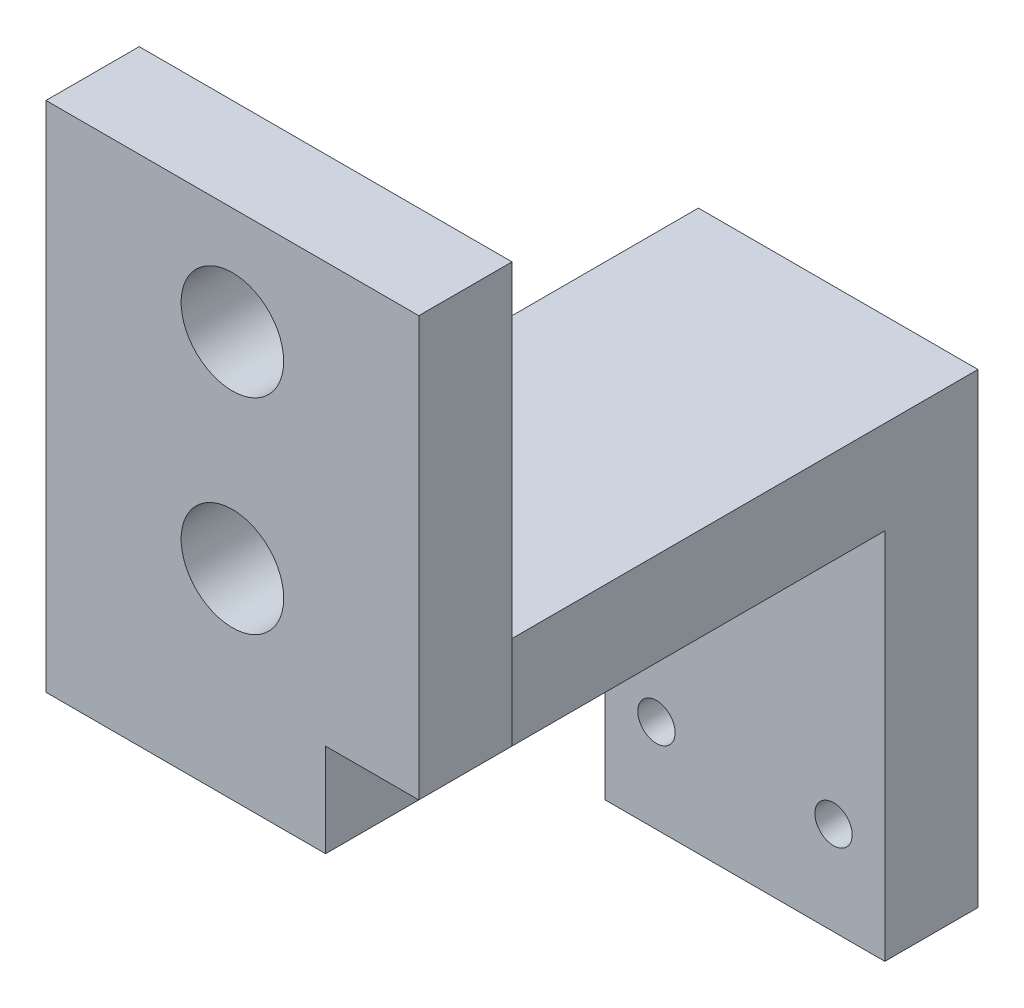
ISO-10303-21;
HEADER;
FILE_DESCRIPTION(('STEP AP214'),'2;1');
FILE_NAME('part.step','',(''),(''),'','','');
FILE_SCHEMA(('AUTOMOTIVE_DESIGN { 1 0 10303 214 1 1 1 1 }'));
ENDSEC;
DATA;
#1=APPLICATION_CONTEXT('core data for automotive mechanical design processes');
#2=APPLICATION_PROTOCOL_DEFINITION('international standard','automotive_design',2000,#1);
#3=PRODUCT_CONTEXT('',#1,'mechanical');
#4=PRODUCT('Part','Part','',(#3));
#5=PRODUCT_RELATED_PRODUCT_CATEGORY('part','',(#4));
#6=PRODUCT_DEFINITION_FORMATION('','',#4);
#7=PRODUCT_DEFINITION_CONTEXT('part definition',#1,'design');
#8=PRODUCT_DEFINITION('design','',#6,#7);
#9=PRODUCT_DEFINITION_SHAPE('','',#8);
#10=(LENGTH_UNIT() NAMED_UNIT(*) SI_UNIT(.MILLI.,.METRE.));
#11=(NAMED_UNIT(*) PLANE_ANGLE_UNIT() SI_UNIT($,.RADIAN.));
#12=(NAMED_UNIT(*) SI_UNIT($,.STERADIAN.) SOLID_ANGLE_UNIT());
#13=UNCERTAINTY_MEASURE_WITH_UNIT(LENGTH_MEASURE(1.E-05),#10,'distance_accuracy_value','');
#14=(GEOMETRIC_REPRESENTATION_CONTEXT(3) GLOBAL_UNCERTAINTY_ASSIGNED_CONTEXT((#13)) GLOBAL_UNIT_ASSIGNED_CONTEXT((#10,
#11,#12)) REPRESENTATION_CONTEXT('',''));
#15=CARTESIAN_POINT('',(0.,0.,0.));
#16=DIRECTION('',(0.,0.,1.));
#17=DIRECTION('',(1.,0.,0.));
#18=AXIS2_PLACEMENT_3D('',#15,#16,#17);
#19=CARTESIAN_POINT('',(0.,0.,5.));
#20=DIRECTION('',(0.,0.,-1.));
#21=DIRECTION('',(-1.,0.,0.));
#22=AXIS2_PLACEMENT_3D('',#19,#20,#21);
#23=PLANE('',#22);
#24=DIRECTION('',(-1.,0.,0.));
#25=VECTOR('',#24,1.);
#26=CARTESIAN_POINT('',(-37.8251466785082,7.96772771097778,5.));
#27=LINE('',#26,#25);
#28=CARTESIAN_POINT('',(-17.8251466785082,7.96772771097778,5.));
#29=VERTEX_POINT('',#28);
#30=CARTESIAN_POINT('',(-37.8251466785082,7.96772771097778,5.));
#31=VERTEX_POINT('',#30);
#32=EDGE_CURVE('E143',#29,#31,#27,.T.);
#33=ORIENTED_EDGE('',*,*,#32,.T.);
#34=DIRECTION('',(0.,-1.,0.));
#35=VECTOR('',#34,1.);
#36=CARTESIAN_POINT('',(-37.8251466785082,7.96772771097778,5.));
#37=LINE('',#36,#35);
#38=CARTESIAN_POINT('',(-37.8251466785082,-19.5322722890222,5.));
#39=VERTEX_POINT('',#38);
#40=EDGE_CURVE('E86',#31,#39,#37,.T.);
#41=ORIENTED_EDGE('',*,*,#40,.T.);
#42=DIRECTION('',(-1.,0.,0.));
#43=VECTOR('',#42,1.);
#44=CARTESIAN_POINT('',(-22.8251466785082,-19.5322722890222,5.));
#45=LINE('',#44,#43);
#46=CARTESIAN_POINT('',(-22.8251466785082,-19.5322722890222,5.));
#47=VERTEX_POINT('',#46);
#48=EDGE_CURVE('E136',#47,#39,#45,.T.);
#49=ORIENTED_EDGE('',*,*,#48,.F.);
#50=DIRECTION('',(0.,1.,0.));
#51=VECTOR('',#50,1.);
#52=CARTESIAN_POINT('',(-22.8251466785082,-19.5322722890222,5.));
#53=LINE('',#52,#51);
#54=CARTESIAN_POINT('',(-22.8251466785082,-14.5322722890222,5.));
#55=VERTEX_POINT('',#54);
#56=EDGE_CURVE('E125',#47,#55,#53,.T.);
#57=ORIENTED_EDGE('',*,*,#56,.T.);
#58=DIRECTION('',(1.,0.,0.));
#59=VECTOR('',#58,1.);
#60=CARTESIAN_POINT('',(-37.8251466785082,-14.5322722890222,5.));
#61=LINE('',#60,#59);
#62=CARTESIAN_POINT('',(-17.8251466785082,-14.5322722890222,5.));
#63=VERTEX_POINT('',#62);
#64=EDGE_CURVE('E133',#55,#63,#61,.T.);
#65=ORIENTED_EDGE('',*,*,#64,.T.);
#66=DIRECTION('',(0.,1.,0.));
#67=VECTOR('',#66,1.);
#68=CARTESIAN_POINT('',(-17.8251466785082,7.96772771097778,5.));
#69=LINE('',#68,#67);
#70=EDGE_CURVE('E63',#63,#29,#69,.T.);
#71=ORIENTED_EDGE('',*,*,#70,.T.);
#72=EDGE_LOOP('',(#33,#41,#49,#57,#65,#71));
#73=FACE_BOUND('',#72,.T.);
#74=CARTESIAN_POINT('',(-27.8251466785082,2.21772771097778,5.));
#75=DIRECTION('',(0.,0.,1.));
#76=DIRECTION('',(1.,0.,0.));
#77=AXIS2_PLACEMENT_3D('',#74,#75,#76);
#78=CIRCLE('',#77,2.75);
#79=CARTESIAN_POINT('',(-25.0751466785082,2.21772771097778,5.));
#80=VERTEX_POINT('',#79);
#81=EDGE_CURVE('E151',#80,#80,#78,.T.);
#82=ORIENTED_EDGE('',*,*,#81,.F.);
#83=EDGE_LOOP('',(#82));
#84=FACE_BOUND('',#83,.T.);
#85=CARTESIAN_POINT('',(-27.8251466785082,-8.78227228902222,5.));
#86=DIRECTION('',(0.,0.,1.));
#87=DIRECTION('',(1.,0.,0.));
#88=AXIS2_PLACEMENT_3D('',#85,#86,#87);
#89=CIRCLE('',#88,2.75);
#90=CARTESIAN_POINT('',(-25.0751466785082,-8.78227228902222,5.));
#91=VERTEX_POINT('',#90);
#92=EDGE_CURVE('E171',#91,#91,#89,.T.);
#93=ORIENTED_EDGE('',*,*,#92,.F.);
#94=EDGE_LOOP('',(#93));
#95=FACE_BOUND('',#94,.T.);
#96=ADVANCED_FACE('F39',(#73,#84,#95),#23,.F.);
#97=CARTESIAN_POINT('',(0.,0.,0.));
#98=DIRECTION('',(0.,0.,-1.));
#99=DIRECTION('',(-1.,0.,0.));
#100=AXIS2_PLACEMENT_3D('',#97,#98,#99);
#101=PLANE('',#100);
#102=CARTESIAN_POINT('',(-27.8251466785082,2.21772771097778,0.));
#103=DIRECTION('',(0.,0.,1.));
#104=DIRECTION('',(1.,0.,0.));
#105=AXIS2_PLACEMENT_3D('',#102,#103,#104);
#106=CIRCLE('',#105,2.75);
#107=CARTESIAN_POINT('',(-25.0751466785082,2.21772771097778,0.));
#108=VERTEX_POINT('',#107);
#109=EDGE_CURVE('E168',#108,#108,#106,.T.);
#110=ORIENTED_EDGE('',*,*,#109,.T.);
#111=EDGE_LOOP('',(#110));
#112=FACE_BOUND('',#111,.T.);
#113=DIRECTION('',(-1.,0.,0.));
#114=VECTOR('',#113,1.);
#115=CARTESIAN_POINT('',(-37.8251466785082,7.96772771097778,0.));
#116=LINE('',#115,#114);
#117=CARTESIAN_POINT('',(-17.8251466785082,7.96772771097778,0.));
#118=VERTEX_POINT('',#117);
#119=CARTESIAN_POINT('',(-37.8251466785082,7.96772771097778,0.));
#120=VERTEX_POINT('',#119);
#121=EDGE_CURVE('E147',#118,#120,#116,.T.);
#122=ORIENTED_EDGE('',*,*,#121,.F.);
#123=DIRECTION('',(0.,1.,0.));
#124=VECTOR('',#123,1.);
#125=CARTESIAN_POINT('',(-17.8251466785082,7.96772771097778,0.));
#126=LINE('',#125,#124);
#127=CARTESIAN_POINT('',(-17.8251466785082,-14.5322722890222,0.));
#128=VERTEX_POINT('',#127);
#129=EDGE_CURVE('E80',#128,#118,#126,.T.);
#130=ORIENTED_EDGE('',*,*,#129,.F.);
#131=DIRECTION('',(1.,0.,0.));
#132=VECTOR('',#131,1.);
#133=CARTESIAN_POINT('',(-37.8251466785082,-14.5322722890222,0.));
#134=LINE('',#133,#132);
#135=CARTESIAN_POINT('',(-22.8251466785082,-14.5322722890222,0.));
#136=VERTEX_POINT('',#135);
#137=EDGE_CURVE('E154',#136,#128,#134,.T.);
#138=ORIENTED_EDGE('',*,*,#137,.F.);
#139=CARTESIAN_POINT('',(-37.8251466785082,-14.5322722890222,0.));
#140=VERTEX_POINT('',#139);
#141=EDGE_CURVE('E155',#140,#136,#134,.T.);
#142=ORIENTED_EDGE('',*,*,#141,.F.);
#143=DIRECTION('',(0.,-1.,0.));
#144=VECTOR('',#143,1.);
#145=CARTESIAN_POINT('',(-37.8251466785082,7.96772771097778,0.));
#146=LINE('',#145,#144);
#147=EDGE_CURVE('E150',#120,#140,#146,.T.);
#148=ORIENTED_EDGE('',*,*,#147,.F.);
#149=EDGE_LOOP('',(#122,#130,#138,#142,#148));
#150=FACE_BOUND('',#149,.T.);
#151=CARTESIAN_POINT('',(-27.8251466785082,-8.78227228902222,0.));
#152=DIRECTION('',(0.,0.,1.));
#153=DIRECTION('',(1.,0.,0.));
#154=AXIS2_PLACEMENT_3D('',#151,#152,#153);
#155=CIRCLE('',#154,2.75);
#156=CARTESIAN_POINT('',(-25.0751466785082,-8.78227228902222,0.));
#157=VERTEX_POINT('',#156);
#158=EDGE_CURVE('E174',#157,#157,#155,.T.);
#159=ORIENTED_EDGE('',*,*,#158,.T.);
#160=EDGE_LOOP('',(#159));
#161=FACE_BOUND('',#160,.T.);
#162=ADVANCED_FACE('F161',(#112,#150,#161),#101,.T.);
#163=CARTESIAN_POINT('',(-37.8251466785082,7.96772771097778,5.));
#164=DIRECTION('',(0.,-1.,0.));
#165=DIRECTION('',(1.,0.,0.));
#166=AXIS2_PLACEMENT_3D('',#163,#164,#165);
#167=PLANE('',#166);
#168=ORIENTED_EDGE('',*,*,#121,.T.);
#169=DIRECTION('',(0.,0.,-1.));
#170=VECTOR('',#169,1.);
#171=CARTESIAN_POINT('',(-37.8251466785082,7.96772771097778,5.));
#172=LINE('',#171,#170);
#173=EDGE_CURVE('E11',#31,#120,#172,.T.);
#174=ORIENTED_EDGE('',*,*,#173,.F.);
#175=ORIENTED_EDGE('',*,*,#32,.F.);
#176=DIRECTION('',(0.,0.,-1.));
#177=VECTOR('',#176,1.);
#178=CARTESIAN_POINT('',(-17.8251466785082,7.96772771097778,5.));
#179=LINE('',#178,#177);
#180=EDGE_CURVE('E141',#29,#118,#179,.T.);
#181=ORIENTED_EDGE('',*,*,#180,.T.);
#182=EDGE_LOOP('',(#168,#174,#175,#181));
#183=FACE_BOUND('',#182,.T.);
#184=ADVANCED_FACE('F41',(#183),#167,.F.);
#185=CARTESIAN_POINT('',(-37.8251466785082,7.96772771097778,5.));
#186=DIRECTION('',(1.,0.,0.));
#187=DIRECTION('',(0.,0.,-1.));
#188=AXIS2_PLACEMENT_3D('',#185,#186,#187);
#189=PLANE('',#188);
#190=ORIENTED_EDGE('',*,*,#147,.T.);
#191=DIRECTION('',(0.,0.,-1.));
#192=VECTOR('',#191,1.);
#193=CARTESIAN_POINT('',(-37.8251466785082,-14.5322722890222,5.));
#194=LINE('',#193,#192);
#195=CARTESIAN_POINT('',(-37.8251466785082,-14.5322722890222,-30.));
#196=VERTEX_POINT('',#195);
#197=EDGE_CURVE('E200',#140,#196,#194,.T.);
#198=ORIENTED_EDGE('',*,*,#197,.T.);
#199=DIRECTION('',(0.,-1.,0.));
#200=VECTOR('',#199,1.);
#201=CARTESIAN_POINT('',(-37.8251466785082,-14.5322722890222,-30.));
#202=LINE('',#201,#200);
#203=CARTESIAN_POINT('',(-37.8251466785082,-39.5322722890222,-30.));
#204=VERTEX_POINT('',#203);
#205=EDGE_CURVE('E197',#196,#204,#202,.T.);
#206=ORIENTED_EDGE('',*,*,#205,.T.);
#207=DIRECTION('',(0.,0.,1.));
#208=VECTOR('',#207,1.);
#209=CARTESIAN_POINT('',(-37.8251466785082,-39.5322722890222,-30.));
#210=LINE('',#209,#208);
#211=CARTESIAN_POINT('',(-37.8251466785082,-39.5322722890222,-25.));
#212=VERTEX_POINT('',#211);
#213=EDGE_CURVE('E194',#204,#212,#210,.T.);
#214=ORIENTED_EDGE('',*,*,#213,.T.);
#215=DIRECTION('',(0.,1.,0.));
#216=VECTOR('',#215,1.);
#217=CARTESIAN_POINT('',(-37.8251466785082,-39.5322722890222,-25.));
#218=LINE('',#217,#216);
#219=CARTESIAN_POINT('',(-37.8251466785082,-19.5322722890222,-25.));
#220=VERTEX_POINT('',#219);
#221=EDGE_CURVE('E191',#212,#220,#218,.T.);
#222=ORIENTED_EDGE('',*,*,#221,.T.);
#223=DIRECTION('',(0.,0.,1.));
#224=VECTOR('',#223,1.);
#225=CARTESIAN_POINT('',(-37.8251466785082,-19.5322722890222,-25.));
#226=LINE('',#225,#224);
#227=EDGE_CURVE('E137',#220,#39,#226,.T.);
#228=ORIENTED_EDGE('',*,*,#227,.T.);
#229=ORIENTED_EDGE('',*,*,#40,.F.);
#230=ORIENTED_EDGE('',*,*,#173,.T.);
#231=EDGE_LOOP('',(#190,#198,#206,#214,#222,#228,#229,#230));
#232=FACE_BOUND('',#231,.T.);
#233=ADVANCED_FACE('F251',(#232),#189,.F.);
#234=CARTESIAN_POINT('',(-37.8251466785082,-14.5322722890222,5.));
#235=DIRECTION('',(0.,1.,0.));
#236=DIRECTION('',(0.,0.,1.));
#237=AXIS2_PLACEMENT_3D('',#234,#235,#236);
#238=PLANE('',#237);
#239=ORIENTED_EDGE('',*,*,#64,.F.);
#240=DIRECTION('',(0.,0.,-1.));
#241=VECTOR('',#240,1.);
#242=CARTESIAN_POINT('',(-22.8251466785082,-14.5322722890222,5.));
#243=LINE('',#242,#241);
#244=EDGE_CURVE('E121',#55,#136,#243,.T.);
#245=ORIENTED_EDGE('',*,*,#244,.T.);
#246=ORIENTED_EDGE('',*,*,#137,.T.);
#247=DIRECTION('',(0.,0.,-1.));
#248=VECTOR('',#247,1.);
#249=CARTESIAN_POINT('',(-17.8251466785082,-14.5322722890222,5.));
#250=LINE('',#249,#248);
#251=EDGE_CURVE('E47',#63,#128,#250,.T.);
#252=ORIENTED_EDGE('',*,*,#251,.F.);
#253=EDGE_LOOP('',(#239,#245,#246,#252));
#254=FACE_BOUND('',#253,.T.);
#255=ADVANCED_FACE('F139',(#254),#238,.F.);
#256=CARTESIAN_POINT('',(-17.8251466785082,7.96772771097778,5.));
#257=DIRECTION('',(-1.,0.,0.));
#258=DIRECTION('',(0.,-1.,0.));
#259=AXIS2_PLACEMENT_3D('',#256,#257,#258);
#260=PLANE('',#259);
#261=ORIENTED_EDGE('',*,*,#129,.T.);
#262=ORIENTED_EDGE('',*,*,#180,.F.);
#263=ORIENTED_EDGE('',*,*,#70,.F.);
#264=ORIENTED_EDGE('',*,*,#251,.T.);
#265=EDGE_LOOP('',(#261,#262,#263,#264));
#266=FACE_BOUND('',#265,.T.);
#267=ADVANCED_FACE('F158',(#266),#260,.F.);
#268=CARTESIAN_POINT('',(-27.8251466785082,2.21772771097778,5.));
#269=DIRECTION('',(0.,0.,-1.));
#270=DIRECTION('',(-1.,0.,0.));
#271=AXIS2_PLACEMENT_3D('',#268,#269,#270);
#272=CYLINDRICAL_SURFACE('',#271,2.75);
#273=ORIENTED_EDGE('',*,*,#81,.T.);
#274=EDGE_LOOP('',(#273));
#275=FACE_BOUND('',#274,.T.);
#276=ORIENTED_EDGE('',*,*,#109,.F.);
#277=EDGE_LOOP('',(#276));
#278=FACE_BOUND('',#277,.T.);
#279=ADVANCED_FACE('F245',(#275,#278),#272,.F.);
#280=CARTESIAN_POINT('',(-27.8251466785082,-8.78227228902222,5.));
#281=DIRECTION('',(0.,0.,-1.));
#282=DIRECTION('',(-1.,0.,0.));
#283=AXIS2_PLACEMENT_3D('',#280,#281,#282);
#284=CYLINDRICAL_SURFACE('',#283,2.75);
#285=ORIENTED_EDGE('',*,*,#92,.T.);
#286=EDGE_LOOP('',(#285));
#287=FACE_BOUND('',#286,.T.);
#288=ORIENTED_EDGE('',*,*,#158,.F.);
#289=EDGE_LOOP('',(#288));
#290=FACE_BOUND('',#289,.T.);
#291=ADVANCED_FACE('F273',(#287,#290),#284,.F.);
#292=CARTESIAN_POINT('',(-22.8251466785082,-19.5322722890222,-25.));
#293=DIRECTION('',(0.,-1.,0.));
#294=DIRECTION('',(0.,0.,-1.));
#295=AXIS2_PLACEMENT_3D('',#292,#293,#294);
#296=PLANE('',#295);
#297=ORIENTED_EDGE('',*,*,#227,.F.);
#298=DIRECTION('',(-1.,0.,0.));
#299=VECTOR('',#298,1.);
#300=CARTESIAN_POINT('',(-22.8251466785082,-19.5322722890222,-25.));
#301=LINE('',#300,#299);
#302=CARTESIAN_POINT('',(-22.8251466785082,-19.5322722890222,-25.));
#303=VERTEX_POINT('',#302);
#304=EDGE_CURVE('E187',#303,#220,#301,.T.);
#305=ORIENTED_EDGE('',*,*,#304,.F.);
#306=DIRECTION('',(0.,0.,1.));
#307=VECTOR('',#306,1.);
#308=CARTESIAN_POINT('',(-22.8251466785082,-19.5322722890222,-25.));
#309=LINE('',#308,#307);
#310=EDGE_CURVE('E183',#303,#47,#309,.T.);
#311=ORIENTED_EDGE('',*,*,#310,.T.);
#312=ORIENTED_EDGE('',*,*,#48,.T.);
#313=EDGE_LOOP('',(#297,#305,#311,#312));
#314=FACE_BOUND('',#313,.T.);
#315=ADVANCED_FACE('F271',(#314),#296,.T.);
#316=CARTESIAN_POINT('',(-22.8251466785082,-39.5322722890222,-25.));
#317=DIRECTION('',(0.,0.,1.));
#318=DIRECTION('',(1.,0.,0.));
#319=AXIS2_PLACEMENT_3D('',#316,#317,#318);
#320=PLANE('',#319);
#321=CARTESIAN_POINT('',(-25.5751466785082,-34.5322722890222,-25.));
#322=DIRECTION('',(0.,0.,1.));
#323=DIRECTION('',(1.,0.,0.));
#324=AXIS2_PLACEMENT_3D('',#321,#322,#323);
#325=CIRCLE('',#324,1.);
#326=CARTESIAN_POINT('',(-24.5751466785082,-34.5322722890222,-25.));
#327=VERTEX_POINT('',#326);
#328=EDGE_CURVE('E202',#327,#327,#325,.T.);
#329=ORIENTED_EDGE('',*,*,#328,.F.);
#330=EDGE_LOOP('',(#329));
#331=FACE_BOUND('',#330,.T.);
#332=CARTESIAN_POINT('',(-35.0751466785082,-34.5322722890222,-25.));
#333=DIRECTION('',(0.,0.,1.));
#334=DIRECTION('',(1.,0.,0.));
#335=AXIS2_PLACEMENT_3D('',#332,#333,#334);
#336=CIRCLE('',#335,0.999999999999998);
#337=CARTESIAN_POINT('',(-34.0751466785082,-34.5322722890222,-25.));
#338=VERTEX_POINT('',#337);
#339=EDGE_CURVE('E212',#338,#338,#336,.T.);
#340=ORIENTED_EDGE('',*,*,#339,.F.);
#341=EDGE_LOOP('',(#340));
#342=FACE_BOUND('',#341,.T.);
#343=ORIENTED_EDGE('',*,*,#221,.F.);
#344=DIRECTION('',(-1.,0.,0.));
#345=VECTOR('',#344,1.);
#346=CARTESIAN_POINT('',(-22.8251466785082,-39.5322722890222,-25.));
#347=LINE('',#346,#345);
#348=CARTESIAN_POINT('',(-22.8251466785082,-39.5322722890222,-25.));
#349=VERTEX_POINT('',#348);
#350=EDGE_CURVE('E185',#349,#212,#347,.T.);
#351=ORIENTED_EDGE('',*,*,#350,.F.);
#352=DIRECTION('',(0.,1.,0.));
#353=VECTOR('',#352,1.);
#354=CARTESIAN_POINT('',(-22.8251466785082,-39.5322722890222,-25.));
#355=LINE('',#354,#353);
#356=EDGE_CURVE('E204',#349,#303,#355,.T.);
#357=ORIENTED_EDGE('',*,*,#356,.T.);
#358=ORIENTED_EDGE('',*,*,#304,.T.);
#359=EDGE_LOOP('',(#343,#351,#357,#358));
#360=FACE_BOUND('',#359,.T.);
#361=ADVANCED_FACE('F269',(#331,#342,#360),#320,.T.);
#362=CARTESIAN_POINT('',(-22.8251466785082,-39.5322722890222,-30.));
#363=DIRECTION('',(0.,-1.,0.));
#364=DIRECTION('',(0.,0.,-1.));
#365=AXIS2_PLACEMENT_3D('',#362,#363,#364);
#366=PLANE('',#365);
#367=ORIENTED_EDGE('',*,*,#213,.F.);
#368=DIRECTION('',(-1.,0.,0.));
#369=VECTOR('',#368,1.);
#370=CARTESIAN_POINT('',(-22.8251466785082,-39.5322722890222,-30.));
#371=LINE('',#370,#369);
#372=CARTESIAN_POINT('',(-22.8251466785082,-39.5322722890222,-30.));
#373=VERTEX_POINT('',#372);
#374=EDGE_CURVE('E182',#373,#204,#371,.T.);
#375=ORIENTED_EDGE('',*,*,#374,.F.);
#376=DIRECTION('',(0.,0.,1.));
#377=VECTOR('',#376,1.);
#378=CARTESIAN_POINT('',(-22.8251466785082,-39.5322722890222,-30.));
#379=LINE('',#378,#377);
#380=EDGE_CURVE('E207',#373,#349,#379,.T.);
#381=ORIENTED_EDGE('',*,*,#380,.T.);
#382=ORIENTED_EDGE('',*,*,#350,.T.);
#383=EDGE_LOOP('',(#367,#375,#381,#382));
#384=FACE_BOUND('',#383,.T.);
#385=ADVANCED_FACE('F265',(#384),#366,.T.);
#386=CARTESIAN_POINT('',(-22.8251466785082,-14.5322722890222,-30.));
#387=DIRECTION('',(0.,0.,-1.));
#388=DIRECTION('',(0.,1.,0.));
#389=AXIS2_PLACEMENT_3D('',#386,#387,#388);
#390=PLANE('',#389);
#391=CARTESIAN_POINT('',(-25.5751466785082,-34.5322722890222,-30.));
#392=DIRECTION('',(0.,0.,1.));
#393=DIRECTION('',(1.,0.,0.));
#394=AXIS2_PLACEMENT_3D('',#391,#392,#393);
#395=CIRCLE('',#394,1.);
#396=CARTESIAN_POINT('',(-24.5751466785082,-34.5322722890222,-30.));
#397=VERTEX_POINT('',#396);
#398=EDGE_CURVE('E215',#397,#397,#395,.T.);
#399=ORIENTED_EDGE('',*,*,#398,.T.);
#400=EDGE_LOOP('',(#399));
#401=FACE_BOUND('',#400,.T.);
#402=CARTESIAN_POINT('',(-35.0751466785082,-34.5322722890222,-30.));
#403=DIRECTION('',(0.,0.,1.));
#404=DIRECTION('',(1.,0.,0.));
#405=AXIS2_PLACEMENT_3D('',#402,#403,#404);
#406=CIRCLE('',#405,0.999999999999998);
#407=CARTESIAN_POINT('',(-34.0751466785082,-34.5322722890222,-30.));
#408=VERTEX_POINT('',#407);
#409=EDGE_CURVE('E216',#408,#408,#406,.T.);
#410=ORIENTED_EDGE('',*,*,#409,.T.);
#411=EDGE_LOOP('',(#410));
#412=FACE_BOUND('',#411,.T.);
#413=ORIENTED_EDGE('',*,*,#205,.F.);
#414=DIRECTION('',(-1.,0.,0.));
#415=VECTOR('',#414,1.);
#416=CARTESIAN_POINT('',(-22.8251466785082,-14.5322722890222,-30.));
#417=LINE('',#416,#415);
#418=CARTESIAN_POINT('',(-22.8251466785082,-14.5322722890222,-30.));
#419=VERTEX_POINT('',#418);
#420=EDGE_CURVE('E179',#419,#196,#417,.T.);
#421=ORIENTED_EDGE('',*,*,#420,.F.);
#422=DIRECTION('',(0.,-1.,0.));
#423=VECTOR('',#422,1.);
#424=CARTESIAN_POINT('',(-22.8251466785082,-14.5322722890222,-30.));
#425=LINE('',#424,#423);
#426=EDGE_CURVE('E130',#419,#373,#425,.T.);
#427=ORIENTED_EDGE('',*,*,#426,.T.);
#428=ORIENTED_EDGE('',*,*,#374,.T.);
#429=EDGE_LOOP('',(#413,#421,#427,#428));
#430=FACE_BOUND('',#429,.T.);
#431=ADVANCED_FACE('F224',(#401,#412,#430),#390,.T.);
#432=CARTESIAN_POINT('',(-22.8251466785082,-14.5322722890222,5.));
#433=DIRECTION('',(0.,1.,0.));
#434=DIRECTION('',(0.,0.,1.));
#435=AXIS2_PLACEMENT_3D('',#432,#433,#434);
#436=PLANE('',#435);
#437=ORIENTED_EDGE('',*,*,#197,.F.);
#438=ORIENTED_EDGE('',*,*,#141,.T.);
#439=EDGE_CURVE('E54',#136,#419,#243,.T.);
#440=ORIENTED_EDGE('',*,*,#439,.T.);
#441=ORIENTED_EDGE('',*,*,#420,.T.);
#442=EDGE_LOOP('',(#437,#438,#440,#441));
#443=FACE_BOUND('',#442,.T.);
#444=ADVANCED_FACE('F257',(#443),#436,.T.);
#445=CARTESIAN_POINT('',(-22.8251466785082,0.,0.));
#446=DIRECTION('',(-1.,0.,0.));
#447=DIRECTION('',(0.,0.,1.));
#448=AXIS2_PLACEMENT_3D('',#445,#446,#447);
#449=PLANE('',#448);
#450=ORIENTED_EDGE('',*,*,#56,.F.);
#451=ORIENTED_EDGE('',*,*,#310,.F.);
#452=ORIENTED_EDGE('',*,*,#356,.F.);
#453=ORIENTED_EDGE('',*,*,#380,.F.);
#454=ORIENTED_EDGE('',*,*,#426,.F.);
#455=ORIENTED_EDGE('',*,*,#439,.F.);
#456=ORIENTED_EDGE('',*,*,#244,.F.);
#457=EDGE_LOOP('',(#450,#451,#452,#453,#454,#455,#456));
#458=FACE_BOUND('',#457,.T.);
#459=ADVANCED_FACE('F123',(#458),#449,.F.);
#460=CARTESIAN_POINT('',(-35.0751466785082,-34.5322722890222,5.001));
#461=DIRECTION('',(0.,0.,-1.));
#462=DIRECTION('',(-1.,0.,0.));
#463=AXIS2_PLACEMENT_3D('',#460,#461,#462);
#464=CYLINDRICAL_SURFACE('',#463,0.999999999999998);
#465=ORIENTED_EDGE('',*,*,#339,.T.);
#466=EDGE_LOOP('',(#465));
#467=FACE_BOUND('',#466,.T.);
#468=ORIENTED_EDGE('',*,*,#409,.F.);
#469=EDGE_LOOP('',(#468));
#470=FACE_BOUND('',#469,.T.);
#471=ADVANCED_FACE('F229',(#467,#470),#464,.F.);
#472=CARTESIAN_POINT('',(-25.5751466785082,-34.5322722890222,5.001));
#473=DIRECTION('',(0.,0.,-1.));
#474=DIRECTION('',(-1.,0.,0.));
#475=AXIS2_PLACEMENT_3D('',#472,#473,#474);
#476=CYLINDRICAL_SURFACE('',#475,1.);
#477=ORIENTED_EDGE('',*,*,#328,.T.);
#478=EDGE_LOOP('',(#477));
#479=FACE_BOUND('',#478,.T.);
#480=ORIENTED_EDGE('',*,*,#398,.F.);
#481=EDGE_LOOP('',(#480));
#482=FACE_BOUND('',#481,.T.);
#483=ADVANCED_FACE('F227',(#479,#482),#476,.F.);
#484=CLOSED_SHELL('',(#96,#162,#184,#233,#255,#267,#279,#291,#315,#361,#385,#431,#444,#459,#471,#483));
#485=MANIFOLD_SOLID_BREP('B2',#484);
#486=ADVANCED_BREP_SHAPE_REPRESENTATION('',(#18,#485),#14);
#487=SHAPE_DEFINITION_REPRESENTATION(#9,#486);
ENDSEC;
END-ISO-10303-21;
